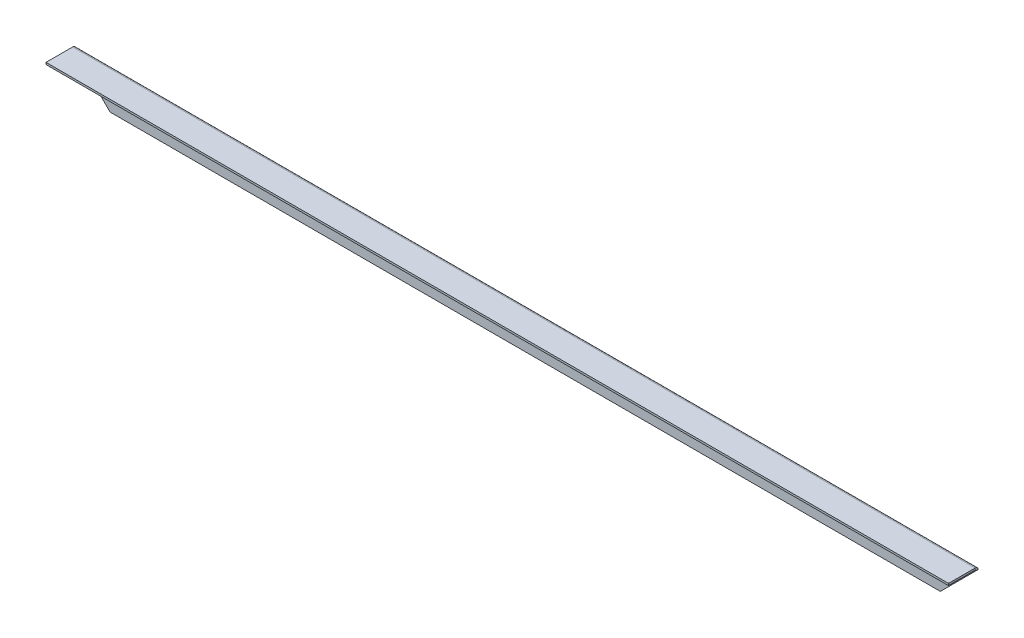
ISO-10303-21;
HEADER;
FILE_DESCRIPTION(('STEP AP214'),'2;1');
FILE_NAME('part.step','',(''),(''),'','','');
FILE_SCHEMA(('AUTOMOTIVE_DESIGN { 1 0 10303 214 1 1 1 1 }'));
ENDSEC;
DATA;
#1=APPLICATION_CONTEXT('core data for automotive mechanical design processes');
#2=APPLICATION_PROTOCOL_DEFINITION('international standard','automotive_design',2000,#1);
#3=PRODUCT_CONTEXT('',#1,'mechanical');
#4=PRODUCT('Part','Part','',(#3));
#5=PRODUCT_RELATED_PRODUCT_CATEGORY('part','',(#4));
#6=PRODUCT_DEFINITION_FORMATION('','',#4);
#7=PRODUCT_DEFINITION_CONTEXT('part definition',#1,'design');
#8=PRODUCT_DEFINITION('design','',#6,#7);
#9=PRODUCT_DEFINITION_SHAPE('','',#8);
#10=(LENGTH_UNIT() NAMED_UNIT(*) SI_UNIT(.MILLI.,.METRE.));
#11=(NAMED_UNIT(*) PLANE_ANGLE_UNIT() SI_UNIT($,.RADIAN.));
#12=(NAMED_UNIT(*) SI_UNIT($,.STERADIAN.) SOLID_ANGLE_UNIT());
#13=UNCERTAINTY_MEASURE_WITH_UNIT(LENGTH_MEASURE(1.E-05),#10,'distance_accuracy_value','');
#14=(GEOMETRIC_REPRESENTATION_CONTEXT(3) GLOBAL_UNCERTAINTY_ASSIGNED_CONTEXT((#13)) GLOBAL_UNIT_ASSIGNED_CONTEXT((#10,
#11,#12)) REPRESENTATION_CONTEXT('',''));
#15=CARTESIAN_POINT('',(0.,0.,0.));
#16=DIRECTION('',(0.,0.,1.));
#17=DIRECTION('',(1.,0.,0.));
#18=AXIS2_PLACEMENT_3D('',#15,#16,#17);
#19=CARTESIAN_POINT('',(0.,120.,-5.13478148889135E-13));
#20=DIRECTION('',(0.,-1.,0.));
#21=DIRECTION('',(0.,0.,-1.));
#22=AXIS2_PLACEMENT_3D('',#19,#20,#21);
#23=PLANE('',#22);
#24=DIRECTION('',(0.,0.,-1.));
#25=VECTOR('',#24,1.);
#26=CARTESIAN_POINT('',(-346.792893218813,120.,-3.88578058618805E-13));
#27=LINE('',#26,#25);
#28=CARTESIAN_POINT('',(-346.792893218813,120.000000000001,21.5));
#29=VERTEX_POINT('',#28);
#30=CARTESIAN_POINT('',(-346.792893218813,120.,0.999999999999765));
#31=VERTEX_POINT('',#30);
#32=EDGE_CURVE('E303',#29,#31,#27,.T.);
#33=ORIENTED_EDGE('',*,*,#32,.F.);
#34=DIRECTION('',(1.,0.,0.));
#35=VECTOR('',#34,1.);
#36=CARTESIAN_POINT('',(0.,120.,21.4999999999999));
#37=LINE('',#36,#35);
#38=CARTESIAN_POINT('',(347.792893218814,120.,21.4999999999998));
#39=VERTEX_POINT('',#38);
#40=EDGE_CURVE('E262',#39,#29,#37,.F.);
#41=ORIENTED_EDGE('',*,*,#40,.F.);
#42=DIRECTION('',(0.,0.,-1.));
#43=VECTOR('',#42,1.);
#44=CARTESIAN_POINT('',(347.792893218814,120.,-6.24500451351651E-13));
#45=LINE('',#44,#43);
#46=CARTESIAN_POINT('',(347.792893218814,120.,0.99999999999958));
#47=VERTEX_POINT('',#46);
#48=EDGE_CURVE('E313',#47,#39,#45,.F.);
#49=ORIENTED_EDGE('',*,*,#48,.F.);
#50=DIRECTION('',(-1.,0.,0.));
#51=VECTOR('',#50,1.);
#52=CARTESIAN_POINT('',(-347.792893218813,120.,0.999999999999987));
#53=LINE('',#52,#51);
#54=EDGE_CURVE('E187',#31,#47,#53,.F.);
#55=ORIENTED_EDGE('',*,*,#54,.F.);
#56=EDGE_LOOP('',(#33,#41,#49,#55));
#57=FACE_BOUND('',#56,.T.);
#58=ADVANCED_FACE('F64',(#57),#23,.F.);
#59=CARTESIAN_POINT('',(347.792893218813,-1271.27647802972,4.24660306919122E-12));
#60=DIRECTION('',(1.,0.,0.));
#61=DIRECTION('',(0.,1.,0.));
#62=AXIS2_PLACEMENT_3D('',#59,#60,#61);
#63=PLANE('',#62);
#64=ORIENTED_EDGE('',*,*,#48,.T.);
#65=DIRECTION('',(0.,1.,0.));
#66=VECTOR('',#65,1.);
#67=CARTESIAN_POINT('',(347.792893218813,-1271.27647802972,21.5000000000043));
#68=LINE('',#67,#66);
#69=CARTESIAN_POINT('',(347.792893218814,118.5,21.4999999999998));
#70=VERTEX_POINT('',#69);
#71=EDGE_CURVE('E14',#70,#39,#68,.T.);
#72=ORIENTED_EDGE('',*,*,#71,.F.);
#73=DIRECTION('',(0.,0.,-1.));
#74=VECTOR('',#73,1.);
#75=CARTESIAN_POINT('',(347.792893218814,118.5,-2.35922392732846E-13));
#76=LINE('',#75,#74);
#77=CARTESIAN_POINT('',(347.792893218814,118.5,0.999999999999765));
#78=VERTEX_POINT('',#77);
#79=EDGE_CURVE('E330',#70,#78,#76,.T.);
#80=ORIENTED_EDGE('',*,*,#79,.T.);
#81=CARTESIAN_POINT('',(347.792893218814,120.,0.999999999999765));
#82=CARTESIAN_POINT('',(347.792893218814,118.5,0.999999999999766));
#83=B_SPLINE_CURVE_WITH_KNOTS('',1,(#81,#82),.UNSPECIFIED.,.F.,.F.,(2,2),(0.,1.),.UNSPECIFIED.);
#84=EDGE_CURVE('E334',#78,#47,#83,.F.);
#85=ORIENTED_EDGE('',*,*,#84,.T.);
#86=EDGE_LOOP('',(#64,#72,#80,#85));
#87=FACE_BOUND('',#86,.T.);
#88=ADVANCED_FACE('F66',(#87),#63,.T.);
#89=CARTESIAN_POINT('',(350.,-1271.27647802972,21.5000000000043));
#90=DIRECTION('',(0.,0.,-1.));
#91=DIRECTION('',(1.,0.,0.));
#92=AXIS2_PLACEMENT_3D('',#89,#90,#91);
#93=PLANE('',#92);
#94=ORIENTED_EDGE('',*,*,#71,.T.);
#95=ORIENTED_EDGE('',*,*,#40,.T.);
#96=DIRECTION('',(0.,1.,0.));
#97=VECTOR('',#96,1.);
#98=CARTESIAN_POINT('',(-346.792893218814,-1271.27647802972,21.5000000000045));
#99=LINE('',#98,#97);
#100=CARTESIAN_POINT('',(-346.792893218813,118.500000000001,21.5));
#101=VERTEX_POINT('',#100);
#102=EDGE_CURVE('E76',#101,#29,#99,.T.);
#103=ORIENTED_EDGE('',*,*,#102,.F.);
#104=DIRECTION('',(1.,0.,0.));
#105=VECTOR('',#104,1.);
#106=CARTESIAN_POINT('',(350.,118.5,21.4999999999998));
#107=LINE('',#106,#105);
#108=EDGE_CURVE('E87',#70,#101,#107,.F.);
#109=ORIENTED_EDGE('',*,*,#108,.F.);
#110=EDGE_LOOP('',(#94,#95,#103,#109));
#111=FACE_BOUND('',#110,.T.);
#112=ADVANCED_FACE('F453',(#111),#93,.F.);
#113=CARTESIAN_POINT('',(-346.792893218814,-1271.27647802972,4.48252546192407E-12));
#114=DIRECTION('',(1.,0.,0.));
#115=DIRECTION('',(0.,1.,0.));
#116=AXIS2_PLACEMENT_3D('',#113,#114,#115);
#117=PLANE('',#116);
#118=ORIENTED_EDGE('',*,*,#102,.T.);
#119=ORIENTED_EDGE('',*,*,#32,.T.);
#120=CARTESIAN_POINT('',(-346.792893218813,118.5,0.999999999999853));
#121=CARTESIAN_POINT('',(-346.792893218813,120.,0.99999999999963));
#122=B_SPLINE_CURVE_WITH_KNOTS('',1,(#120,#121),.UNSPECIFIED.,.F.,.F.,(2,2),(0.,1.),.UNSPECIFIED.);
#123=CARTESIAN_POINT('',(-346.792893218813,118.5,0.999999999999765));
#124=VERTEX_POINT('',#123);
#125=EDGE_CURVE('E340',#124,#31,#122,.T.);
#126=ORIENTED_EDGE('',*,*,#125,.F.);
#127=DIRECTION('',(0.,0.,-1.));
#128=VECTOR('',#127,1.);
#129=CARTESIAN_POINT('',(-346.792893218813,118.500000000001,0.));
#130=LINE('',#129,#128);
#131=EDGE_CURVE('E98',#101,#124,#130,.T.);
#132=ORIENTED_EDGE('',*,*,#131,.F.);
#133=EDGE_LOOP('',(#118,#119,#126,#132));
#134=FACE_BOUND('',#133,.T.);
#135=ADVANCED_FACE('F448',(#134),#117,.F.);
#136=CARTESIAN_POINT('',(0.,118.5,-5.13478148889135E-13));
#137=DIRECTION('',(0.,-1.,0.));
#138=DIRECTION('',(0.,0.,-1.));
#139=AXIS2_PLACEMENT_3D('',#136,#137,#138);
#140=PLANE('',#139);
#141=ORIENTED_EDGE('',*,*,#79,.F.);
#142=ORIENTED_EDGE('',*,*,#108,.T.);
#143=ORIENTED_EDGE('',*,*,#131,.T.);
#144=DIRECTION('',(-1.,0.,0.));
#145=VECTOR('',#144,1.);
#146=CARTESIAN_POINT('',(-347.792893218813,118.5,0.999999999999987));
#147=LINE('',#146,#145);
#148=EDGE_CURVE('E341',#124,#78,#147,.F.);
#149=ORIENTED_EDGE('',*,*,#148,.T.);
#150=EDGE_LOOP('',(#141,#142,#143,#149));
#151=FACE_BOUND('',#150,.T.);
#152=ADVANCED_FACE('F443',(#151),#140,.T.);
#153=CARTESIAN_POINT('',(-320.,90.0000000000001,1389.08926998951));
#154=DIRECTION('',(0.,1.,0.));
#155=DIRECTION('',(0.,0.,1.));
#156=AXIS2_PLACEMENT_3D('',#153,#154,#155);
#157=PLANE('',#156);
#158=DIRECTION('',(-1.,0.,0.));
#159=VECTOR('',#158,1.);
#160=CARTESIAN_POINT('',(0.,90.0000000000001,-1.5));
#161=LINE('',#160,#159);
#162=CARTESIAN_POINT('',(320.,90.0000000000001,-1.5));
#163=VERTEX_POINT('',#162);
#164=CARTESIAN_POINT('',(-319.,90.0000000000001,-1.50000000000006));
#165=VERTEX_POINT('',#164);
#166=EDGE_CURVE('E202',#163,#165,#161,.T.);
#167=ORIENTED_EDGE('',*,*,#166,.F.);
#168=DIRECTION('',(0.,0.,-1.));
#169=VECTOR('',#168,1.);
#170=CARTESIAN_POINT('',(320.,90.0000000000001,1389.08926998951));
#171=LINE('',#170,#169);
#172=CARTESIAN_POINT('',(320.,90.0000000000001,0.));
#173=VERTEX_POINT('',#172);
#174=EDGE_CURVE('E197',#173,#163,#171,.T.);
#175=ORIENTED_EDGE('',*,*,#174,.F.);
#176=DIRECTION('',(1.,0.,0.));
#177=VECTOR('',#176,1.);
#178=CARTESIAN_POINT('',(-320.,90.0000000000001,0.));
#179=LINE('',#178,#177);
#180=CARTESIAN_POINT('',(-319.,90.0000000000001,0.));
#181=VERTEX_POINT('',#180);
#182=EDGE_CURVE('E275',#181,#173,#179,.T.);
#183=ORIENTED_EDGE('',*,*,#182,.F.);
#184=DIRECTION('',(0.,0.,-1.));
#185=VECTOR('',#184,1.);
#186=CARTESIAN_POINT('',(-319.,90.0000000000001,1389.08926998951));
#187=LINE('',#186,#185);
#188=EDGE_CURVE('E174',#181,#165,#187,.T.);
#189=ORIENTED_EDGE('',*,*,#188,.T.);
#190=EDGE_LOOP('',(#167,#175,#183,#189));
#191=FACE_BOUND('',#190,.T.);
#192=ADVANCED_FACE('F301',(#191),#157,.F.);
#193=CARTESIAN_POINT('',(0.,0.,0.));
#194=DIRECTION('',(0.,0.,-1.));
#195=DIRECTION('',(-1.,0.,0.));
#196=AXIS2_PLACEMENT_3D('',#193,#194,#195);
#197=PLANE('',#196);
#198=DIRECTION('',(-1.,0.,0.));
#199=VECTOR('',#198,1.);
#200=CARTESIAN_POINT('',(0.,117.5,0.));
#201=LINE('',#200,#199);
#202=CARTESIAN_POINT('',(-346.5,117.5,0.));
#203=VERTEX_POINT('',#202);
#204=CARTESIAN_POINT('',(347.5,117.5,-2.32452945780892E-13));
#205=VERTEX_POINT('',#204);
#206=EDGE_CURVE('E175',#203,#205,#201,.F.);
#207=ORIENTED_EDGE('',*,*,#206,.F.);
#208=DIRECTION('',(0.707106781186546,-0.707106781186549,0.));
#209=VECTOR('',#208,1.);
#210=CARTESIAN_POINT('',(-114.000000000001,-115.,0.));
#211=LINE('',#210,#209);
#212=EDGE_CURVE('E280',#203,#181,#211,.T.);
#213=ORIENTED_EDGE('',*,*,#212,.T.);
#214=ORIENTED_EDGE('',*,*,#182,.T.);
#215=DIRECTION('',(0.707106781186548,0.707106781186547,0.));
#216=VECTOR('',#215,1.);
#217=CARTESIAN_POINT('',(115.,-115.,0.));
#218=LINE('',#217,#216);
#219=EDGE_CURVE('E279',#173,#205,#218,.T.);
#220=ORIENTED_EDGE('',*,*,#219,.T.);
#221=EDGE_LOOP('',(#207,#213,#214,#220));
#222=FACE_BOUND('',#221,.T.);
#223=ADVANCED_FACE('F239',(#222),#197,.F.);
#224=CARTESIAN_POINT('',(-114.000000000001,-115.,1389.08926998951));
#225=DIRECTION('',(0.707106781186549,0.707106781186546,0.));
#226=DIRECTION('',(-0.707106781186546,0.707106781186549,0.));
#227=AXIS2_PLACEMENT_3D('',#224,#225,#226);
#228=PLANE('',#227);
#229=DIRECTION('',(0.707106781186546,-0.707106781186549,0.));
#230=VECTOR('',#229,1.);
#231=CARTESIAN_POINT('',(-114.000000000001,-115.,-1.5));
#232=LINE('',#231,#230);
#233=CARTESIAN_POINT('',(-346.5,117.5,-1.50000000000006));
#234=VERTEX_POINT('',#233);
#235=EDGE_CURVE('E207',#234,#165,#232,.T.);
#236=ORIENTED_EDGE('',*,*,#235,.T.);
#237=ORIENTED_EDGE('',*,*,#188,.F.);
#238=ORIENTED_EDGE('',*,*,#212,.F.);
#239=CARTESIAN_POINT('',(-346.5,117.5,-1.5));
#240=CARTESIAN_POINT('',(-346.5,117.5,0.));
#241=B_SPLINE_CURVE_WITH_KNOTS('',1,(#239,#240),.UNSPECIFIED.,.F.,.F.,(2,2),(0.,1.),.UNSPECIFIED.);
#242=EDGE_CURVE('E209',#203,#234,#241,.F.);
#243=ORIENTED_EDGE('',*,*,#242,.T.);
#244=EDGE_LOOP('',(#236,#237,#238,#243));
#245=FACE_BOUND('',#244,.T.);
#246=ADVANCED_FACE('F229',(#245),#228,.F.);
#247=CARTESIAN_POINT('',(0.,0.,-1.5));
#248=DIRECTION('',(0.,0.,-1.));
#249=DIRECTION('',(-1.,0.,0.));
#250=AXIS2_PLACEMENT_3D('',#247,#248,#249);
#251=PLANE('',#250);
#252=ORIENTED_EDGE('',*,*,#235,.F.);
#253=DIRECTION('',(-1.,0.,0.));
#254=VECTOR('',#253,1.);
#255=CARTESIAN_POINT('',(0.,117.5,-1.5));
#256=LINE('',#255,#254);
#257=CARTESIAN_POINT('',(347.5,117.5,-1.50000000000023));
#258=VERTEX_POINT('',#257);
#259=EDGE_CURVE('E185',#234,#258,#256,.F.);
#260=ORIENTED_EDGE('',*,*,#259,.T.);
#261=DIRECTION('',(0.707106781186548,0.707106781186547,0.));
#262=VECTOR('',#261,1.);
#263=CARTESIAN_POINT('',(115.,-115.,-1.5));
#264=LINE('',#263,#262);
#265=EDGE_CURVE('E194',#163,#258,#264,.T.);
#266=ORIENTED_EDGE('',*,*,#265,.F.);
#267=ORIENTED_EDGE('',*,*,#166,.T.);
#268=EDGE_LOOP('',(#252,#260,#266,#267));
#269=FACE_BOUND('',#268,.T.);
#270=ADVANCED_FACE('F206',(#269),#251,.T.);
#271=CARTESIAN_POINT('',(115.,-115.,1389.08926998951));
#272=DIRECTION('',(-0.707106781186547,0.707106781186548,0.));
#273=DIRECTION('',(-0.707106781186548,-0.707106781186547,0.));
#274=AXIS2_PLACEMENT_3D('',#271,#272,#273);
#275=PLANE('',#274);
#276=ORIENTED_EDGE('',*,*,#265,.T.);
#277=CARTESIAN_POINT('',(347.5,117.5,-2.32452945780892E-13));
#278=CARTESIAN_POINT('',(347.5,117.5,-1.50000000000023));
#279=B_SPLINE_CURVE_WITH_KNOTS('',1,(#277,#278),.UNSPECIFIED.,.F.,.F.,(2,2),(0.,1.),.UNSPECIFIED.);
#280=EDGE_CURVE('E158',#205,#258,#279,.T.);
#281=ORIENTED_EDGE('',*,*,#280,.F.);
#282=ORIENTED_EDGE('',*,*,#219,.F.);
#283=ORIENTED_EDGE('',*,*,#174,.T.);
#284=EDGE_LOOP('',(#276,#281,#282,#283));
#285=FACE_BOUND('',#284,.T.);
#286=ADVANCED_FACE('F195',(#285),#275,.F.);
#287=CARTESIAN_POINT('',(347.792893218814,120.,0.999999999999765));
#288=CARTESIAN_POINT('',(347.76848107427,120.,0.672692089510366));
#289=CARTESIAN_POINT('',(347.744077682345,119.934931691671,0.345630289101566));
#290=CARTESIAN_POINT('',(347.695262145876,119.684465970886,-0.259047450927482));
#291=CARTESIAN_POINT('',(347.670854377641,119.499167105995,-0.536366799937521));
#292=CARTESIAN_POINT('',(347.622038841172,119.036366799937,-0.999167105995684));
#293=CARTESIAN_POINT('',(347.597631072938,118.759047450927,-1.18446597088588));
#294=CARTESIAN_POINT('',(347.548815536469,118.154369710898,-1.43493169167102));
#295=CARTESIAN_POINT('',(347.524412144544,117.827307910489,-1.50000000000023));
#296=CARTESIAN_POINT('',(347.5,117.5,-1.50000000000023));
#297=CARTESIAN_POINT('',(347.792893218814,118.5,0.999999999999766));
#298=CARTESIAN_POINT('',(347.768481197786,118.5,0.869077498224523));
#299=CARTESIAN_POINT('',(347.744077682345,118.473972676668,0.738252115640485));
#300=CARTESIAN_POINT('',(347.695262145876,118.373786388354,0.496381019628866));
#301=CARTESIAN_POINT('',(347.670854377641,118.299666842398,0.385453280024851));
#302=CARTESIAN_POINT('',(347.622038841172,118.114546719975,0.200333157601586));
#303=CARTESIAN_POINT('',(347.597631072938,118.003618980371,0.126213611645508));
#304=CARTESIAN_POINT('',(347.548815536469,117.761747884359,0.026027323331451));
#305=CARTESIAN_POINT('',(347.524412021028,117.630922501775,-2.32608033575147E-13));
#306=CARTESIAN_POINT('',(347.5,117.5,-2.32452945780892E-13));
#307=B_SPLINE_SURFACE_WITH_KNOTS('',1,3,((#287,#288,#289,#290,#291,#292,#293,#294,#295,#296),
(#297,#298,#299,#300,#301,#302,#303,#304,#305,#306)),.UNSPECIFIED.,.F.,.F.,.F.,(2,2),(4,2,2,2,
4),(0.,1.),(0.,0.25,0.5,0.75,1.),.UNSPECIFIED.);
#308=CARTESIAN_POINT('',(347.792893218814,118.5,0.999999999999766));
#309=CARTESIAN_POINT('',(347.768481197786,118.5,0.869077498224523));
#310=CARTESIAN_POINT('',(347.744077682345,118.473972676668,0.738252115640485));
#311=CARTESIAN_POINT('',(347.695262145876,118.373786388354,0.496381019628866));
#312=CARTESIAN_POINT('',(347.670854377641,118.299666842398,0.385453280024851));
#313=CARTESIAN_POINT('',(347.622038841172,118.114546719975,0.200333157601586));
#314=CARTESIAN_POINT('',(347.597631072938,118.003618980371,0.126213611645508));
#315=CARTESIAN_POINT('',(347.548815536469,117.761747884359,0.026027323331451));
#316=CARTESIAN_POINT('',(347.524412021028,117.630922501775,-2.32608033575147E-13));
#317=CARTESIAN_POINT('',(347.5,117.5,-2.32452945780892E-13));
#318=B_SPLINE_CURVE_WITH_KNOTS('',3,(#308,#309,#310,#311,#312,#313,#314,#315,#316,#317),
.UNSPECIFIED.,.F.,.F.,(4,2,2,2,4),(0.,0.25,0.5,0.75,1.),.UNSPECIFIED.);
#319=EDGE_CURVE('E166',#78,#205,#318,.T.);
#320=CARTESIAN_POINT('',(347.5,117.5,-1.50000000000023));
#321=CARTESIAN_POINT('',(347.524412144544,117.827307910489,-1.50000000000023));
#322=CARTESIAN_POINT('',(347.548815536469,118.154369710898,-1.43493169167102));
#323=CARTESIAN_POINT('',(347.597631072938,118.759047450927,-1.18446597088588));
#324=CARTESIAN_POINT('',(347.622038841172,119.036366799937,-0.999167105995684));
#325=CARTESIAN_POINT('',(347.670854377641,119.499167105995,-0.536366799937521));
#326=CARTESIAN_POINT('',(347.695262145876,119.684465970886,-0.259047450927482));
#327=CARTESIAN_POINT('',(347.744077682345,119.934931691671,0.345630289101566));
#328=CARTESIAN_POINT('',(347.76848107427,120.,0.672692089510366));
#329=CARTESIAN_POINT('',(347.792893218814,120.,0.999999999999765));
#330=B_SPLINE_CURVE_WITH_KNOTS('',3,(#320,#321,#322,#323,#324,#325,#326,#327,#328,#329),
.UNSPECIFIED.,.F.,.F.,(4,2,2,2,4),(0.,0.25,0.5,0.75,1.),.UNSPECIFIED.);
#331=EDGE_CURVE('E163',#47,#258,#330,.F.);
#332=ORIENTED_EDGE('',*,*,#84,.F.);
#333=ORIENTED_EDGE('',*,*,#319,.T.);
#334=ORIENTED_EDGE('',*,*,#280,.T.);
#335=ORIENTED_EDGE('',*,*,#331,.F.);
#336=EDGE_LOOP('',(#332,#333,#334,#335));
#337=FACE_BOUND('',#336,.T.);
#338=ADVANCED_FACE('F162',(#337),#307,.T.);
#339=CARTESIAN_POINT('',(-346.5,117.5,-1.5));
#340=CARTESIAN_POINT('',(-346.524412144544,117.82730791049,-1.5));
#341=CARTESIAN_POINT('',(-346.548815536469,118.154369710899,-1.4349316916708));
#342=CARTESIAN_POINT('',(-346.597631072938,118.759047450928,-1.1844659708857));
#343=CARTESIAN_POINT('',(-346.622038841172,119.036366799938,-0.99916710599554));
#344=CARTESIAN_POINT('',(-346.670854377641,119.499167105996,-0.536366799937455));
#345=CARTESIAN_POINT('',(-346.695262145875,119.684465970886,-0.259047450927461));
#346=CARTESIAN_POINT('',(-346.744077682344,119.934931691671,0.345630289101502));
#347=CARTESIAN_POINT('',(-346.768481074269,120.,0.672692089510276));
#348=CARTESIAN_POINT('',(-346.792893218813,120.,0.99999999999963));
#349=CARTESIAN_POINT('',(-346.5,117.5,0.));
#350=CARTESIAN_POINT('',(-346.524412021028,117.630922501776,0.));
#351=CARTESIAN_POINT('',(-346.548815536469,117.76174788436,0.0260273233316819));
#352=CARTESIAN_POINT('',(-346.597631072938,118.003618980371,0.126213611645721));
#353=CARTESIAN_POINT('',(-346.622038841172,118.114546719975,0.200333157601786));
#354=CARTESIAN_POINT('',(-346.670854377641,118.299666842399,0.385453280025019));
#355=CARTESIAN_POINT('',(-346.695262145875,118.373786388355,0.496381019629017));
#356=CARTESIAN_POINT('',(-346.744077682344,118.473972676669,0.738252115640602));
#357=CARTESIAN_POINT('',(-346.768481197785,118.5,0.86907749822458));
#358=CARTESIAN_POINT('',(-346.792893218813,118.5,0.999999999999853));
#359=B_SPLINE_SURFACE_WITH_KNOTS('',1,3,((#339,#340,#341,#342,#343,#344,#345,#346,#347,#348),
(#349,#350,#351,#352,#353,#354,#355,#356,#357,#358)),.UNSPECIFIED.,.F.,.F.,.F.,(2,2),(4,2,2,2,
4),(0.,1.),(0.,0.25,0.5,0.75,1.),.UNSPECIFIED.);
#360=CARTESIAN_POINT('',(-346.5,117.5,0.));
#361=CARTESIAN_POINT('',(-346.524412021028,117.630922501776,0.));
#362=CARTESIAN_POINT('',(-346.548815536469,117.76174788436,0.0260273233316819));
#363=CARTESIAN_POINT('',(-346.597631072938,118.003618980371,0.126213611645721));
#364=CARTESIAN_POINT('',(-346.622038841172,118.114546719975,0.200333157601786));
#365=CARTESIAN_POINT('',(-346.670854377641,118.299666842399,0.385453280025019));
#366=CARTESIAN_POINT('',(-346.695262145875,118.373786388355,0.496381019629017));
#367=CARTESIAN_POINT('',(-346.744077682344,118.473972676669,0.738252115640602));
#368=CARTESIAN_POINT('',(-346.768481197785,118.5,0.86907749822458));
#369=CARTESIAN_POINT('',(-346.792893218813,118.5,0.999999999999853));
#370=B_SPLINE_CURVE_WITH_KNOTS('',3,(#360,#361,#362,#363,#364,#365,#366,#367,#368,#369),
.UNSPECIFIED.,.F.,.F.,(4,2,2,2,4),(0.,0.25,0.5,0.75,1.),.UNSPECIFIED.);
#371=EDGE_CURVE('E190',#203,#124,#370,.T.);
#372=CARTESIAN_POINT('',(-346.792893218813,120.,0.99999999999963));
#373=CARTESIAN_POINT('',(-346.768481074269,120.,0.672692089510276));
#374=CARTESIAN_POINT('',(-346.744077682344,119.934931691671,0.345630289101502));
#375=CARTESIAN_POINT('',(-346.695262145875,119.684465970886,-0.259047450927461));
#376=CARTESIAN_POINT('',(-346.670854377641,119.499167105996,-0.536366799937455));
#377=CARTESIAN_POINT('',(-346.622038841172,119.036366799938,-0.99916710599554));
#378=CARTESIAN_POINT('',(-346.597631072938,118.759047450928,-1.1844659708857));
#379=CARTESIAN_POINT('',(-346.548815536469,118.154369710899,-1.4349316916708));
#380=CARTESIAN_POINT('',(-346.524412144544,117.82730791049,-1.5));
#381=CARTESIAN_POINT('',(-346.5,117.5,-1.5));
#382=B_SPLINE_CURVE_WITH_KNOTS('',3,(#372,#373,#374,#375,#376,#377,#378,#379,#380,#381),
.UNSPECIFIED.,.F.,.F.,(4,2,2,2,4),(0.,0.25,0.5,0.75,1.),.UNSPECIFIED.);
#383=EDGE_CURVE('E189',#234,#31,#382,.F.);
#384=ORIENTED_EDGE('',*,*,#371,.T.);
#385=ORIENTED_EDGE('',*,*,#125,.T.);
#386=ORIENTED_EDGE('',*,*,#383,.F.);
#387=ORIENTED_EDGE('',*,*,#242,.F.);
#388=EDGE_LOOP('',(#384,#385,#386,#387));
#389=FACE_BOUND('',#388,.T.);
#390=ADVANCED_FACE('F373',(#389),#359,.T.);
#391=CARTESIAN_POINT('',(1044.06723515695,117.5,0.999999999999529));
#392=DIRECTION('',(-1.,0.,0.));
#393=DIRECTION('',(0.,-1.,0.));
#394=AXIS2_PLACEMENT_3D('',#391,#392,#393);
#395=CYLINDRICAL_SURFACE('',#394,2.5);
#396=ORIENTED_EDGE('',*,*,#259,.F.);
#397=ORIENTED_EDGE('',*,*,#383,.T.);
#398=ORIENTED_EDGE('',*,*,#54,.T.);
#399=ORIENTED_EDGE('',*,*,#331,.T.);
#400=EDGE_LOOP('',(#396,#397,#398,#399));
#401=FACE_BOUND('',#400,.T.);
#402=ADVANCED_FACE('F182',(#401),#395,.T.);
#403=CARTESIAN_POINT('',(1044.06723515695,117.5,0.999999999999529));
#404=DIRECTION('',(-1.,0.,0.));
#405=DIRECTION('',(0.,-1.,0.));
#406=AXIS2_PLACEMENT_3D('',#403,#404,#405);
#407=CYLINDRICAL_SURFACE('',#406,0.999999999999999);
#408=ORIENTED_EDGE('',*,*,#206,.T.);
#409=ORIENTED_EDGE('',*,*,#319,.F.);
#410=ORIENTED_EDGE('',*,*,#148,.F.);
#411=ORIENTED_EDGE('',*,*,#371,.F.);
#412=EDGE_LOOP('',(#408,#409,#410,#411));
#413=FACE_BOUND('',#412,.T.);
#414=ADVANCED_FACE('F474',(#413),#407,.F.);
#415=CLOSED_SHELL('',(#58,#88,#112,#135,#152,#192,#223,#246,#270,#286,#338,#390,#402,#414));
#416=MANIFOLD_SOLID_BREP('B2',#415);
#417=ADVANCED_BREP_SHAPE_REPRESENTATION('',(#18,#416),#14);
#418=SHAPE_DEFINITION_REPRESENTATION(#9,#417);
ENDSEC;
END-ISO-10303-21;
